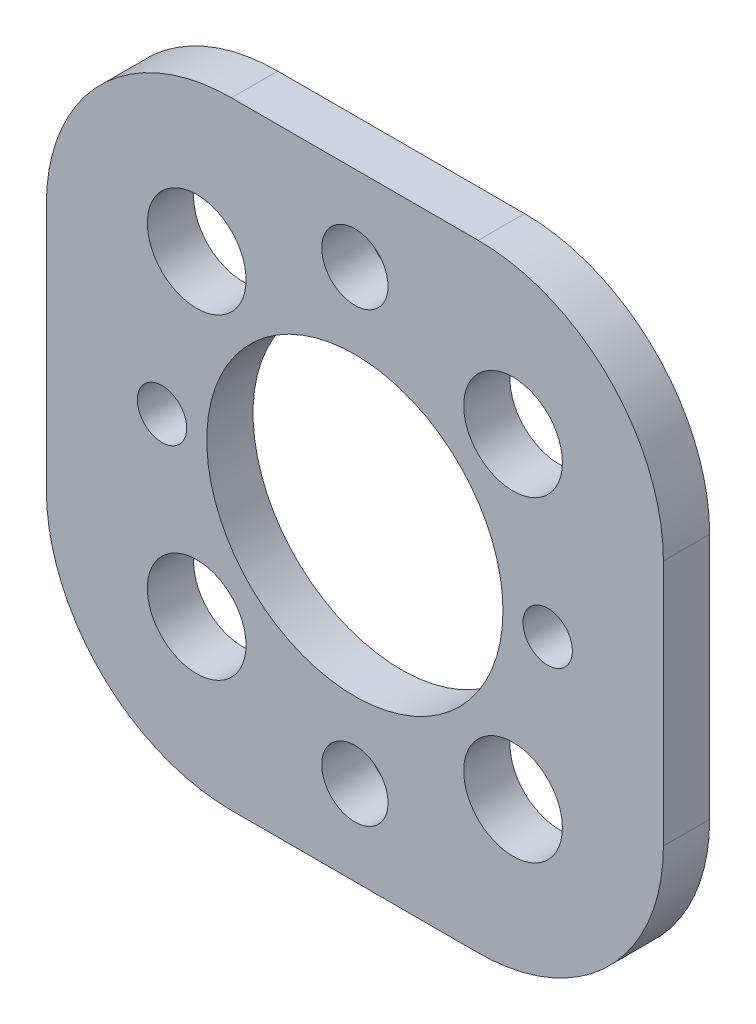
ISO-10303-21;
HEADER;
FILE_DESCRIPTION(('STEP AP214'),'2;1');
FILE_NAME('part.step','',(''),(''),'','','');
FILE_SCHEMA(('AUTOMOTIVE_DESIGN { 1 0 10303 214 1 1 1 1 }'));
ENDSEC;
DATA;
#1=APPLICATION_CONTEXT('core data for automotive mechanical design processes');
#2=APPLICATION_PROTOCOL_DEFINITION('international standard','automotive_design',2000,#1);
#3=PRODUCT_CONTEXT('',#1,'mechanical');
#4=PRODUCT('Part','Part','',(#3));
#5=PRODUCT_RELATED_PRODUCT_CATEGORY('part','',(#4));
#6=PRODUCT_DEFINITION_FORMATION('','',#4);
#7=PRODUCT_DEFINITION_CONTEXT('part definition',#1,'design');
#8=PRODUCT_DEFINITION('design','',#6,#7);
#9=PRODUCT_DEFINITION_SHAPE('','',#8);
#10=(LENGTH_UNIT() NAMED_UNIT(*) SI_UNIT(.MILLI.,.METRE.));
#11=(NAMED_UNIT(*) PLANE_ANGLE_UNIT() SI_UNIT($,.RADIAN.));
#12=(NAMED_UNIT(*) SI_UNIT($,.STERADIAN.) SOLID_ANGLE_UNIT());
#13=UNCERTAINTY_MEASURE_WITH_UNIT(LENGTH_MEASURE(1.E-05),#10,'distance_accuracy_value','');
#14=(GEOMETRIC_REPRESENTATION_CONTEXT(3) GLOBAL_UNCERTAINTY_ASSIGNED_CONTEXT((#13)) GLOBAL_UNIT_ASSIGNED_CONTEXT((#10,
#11,#12)) REPRESENTATION_CONTEXT('',''));
#15=CARTESIAN_POINT('',(0.,0.,0.));
#16=DIRECTION('',(0.,0.,1.));
#17=DIRECTION('',(1.,0.,0.));
#18=AXIS2_PLACEMENT_3D('',#15,#16,#17);
#19=CARTESIAN_POINT('',(-8.,-8.,3.));
#20=DIRECTION('',(0.,0.,-1.));
#21=DIRECTION('',(-1.,0.,0.));
#22=AXIS2_PLACEMENT_3D('',#19,#20,#21);
#23=PLANE('',#22);
#24=CARTESIAN_POINT('',(-8.,-8.,3.));
#25=DIRECTION('',(0.,0.,1.));
#26=DIRECTION('',(-1.,0.,0.));
#27=AXIS2_PLACEMENT_3D('',#24,#25,#26);
#28=CIRCLE('',#27,12.);
#29=CARTESIAN_POINT('',(-20.,-7.99999999999991,3.));
#30=VERTEX_POINT('',#29);
#31=CARTESIAN_POINT('',(-7.99999999999991,-20.,3.));
#32=VERTEX_POINT('',#31);
#33=EDGE_CURVE('E172',#30,#32,#28,.T.);
#34=ORIENTED_EDGE('',*,*,#33,.T.);
#35=DIRECTION('',(1.,0.,0.));
#36=VECTOR('',#35,1.);
#37=CARTESIAN_POINT('',(7.99999999999991,-20.,3.));
#38=LINE('',#37,#36);
#39=CARTESIAN_POINT('',(7.99999999999991,-20.,3.));
#40=VERTEX_POINT('',#39);
#41=EDGE_CURVE('E106',#32,#40,#38,.T.);
#42=ORIENTED_EDGE('',*,*,#41,.T.);
#43=CARTESIAN_POINT('',(8.,-8.,3.));
#44=DIRECTION('',(0.,0.,1.));
#45=DIRECTION('',(1.,0.,0.));
#46=AXIS2_PLACEMENT_3D('',#43,#44,#45);
#47=CIRCLE('',#46,12.);
#48=CARTESIAN_POINT('',(20.,-8.,3.));
#49=VERTEX_POINT('',#48);
#50=EDGE_CURVE('E195',#40,#49,#47,.T.);
#51=ORIENTED_EDGE('',*,*,#50,.T.);
#52=DIRECTION('',(0.,1.,0.));
#53=VECTOR('',#52,1.);
#54=CARTESIAN_POINT('',(20.,-7.99999999999991,3.));
#55=LINE('',#54,#53);
#56=CARTESIAN_POINT('',(20.,7.99999999999992,3.));
#57=VERTEX_POINT('',#56);
#58=EDGE_CURVE('E210',#49,#57,#55,.T.);
#59=ORIENTED_EDGE('',*,*,#58,.T.);
#60=CARTESIAN_POINT('',(8.,8.00000000000001,3.));
#61=DIRECTION('',(0.,0.,1.));
#62=DIRECTION('',(1.,0.,0.));
#63=AXIS2_PLACEMENT_3D('',#60,#61,#62);
#64=CIRCLE('',#63,12.);
#65=CARTESIAN_POINT('',(7.99999999999991,20.,3.));
#66=VERTEX_POINT('',#65);
#67=EDGE_CURVE('E122',#57,#66,#64,.T.);
#68=ORIENTED_EDGE('',*,*,#67,.T.);
#69=DIRECTION('',(-1.,0.,0.));
#70=VECTOR('',#69,1.);
#71=CARTESIAN_POINT('',(7.99999999999991,20.,3.));
#72=LINE('',#71,#70);
#73=CARTESIAN_POINT('',(-7.99999999999992,20.,3.));
#74=VERTEX_POINT('',#73);
#75=EDGE_CURVE('E116',#66,#74,#72,.T.);
#76=ORIENTED_EDGE('',*,*,#75,.T.);
#77=CARTESIAN_POINT('',(-8.00000000000001,8.,3.));
#78=DIRECTION('',(0.,0.,1.));
#79=DIRECTION('',(1.,0.,0.));
#80=AXIS2_PLACEMENT_3D('',#77,#78,#79);
#81=CIRCLE('',#80,12.);
#82=CARTESIAN_POINT('',(-20.,7.99999999999992,3.));
#83=VERTEX_POINT('',#82);
#84=EDGE_CURVE('E125',#74,#83,#81,.T.);
#85=ORIENTED_EDGE('',*,*,#84,.T.);
#86=DIRECTION('',(0.,-1.,0.));
#87=VECTOR('',#86,1.);
#88=CARTESIAN_POINT('',(-20.,-7.99999999999991,3.));
#89=LINE('',#88,#87);
#90=EDGE_CURVE('E65',#83,#30,#89,.T.);
#91=ORIENTED_EDGE('',*,*,#90,.T.);
#92=EDGE_LOOP('',(#34,#42,#51,#59,#68,#76,#85,#91));
#93=FACE_BOUND('',#92,.T.);
#94=CARTESIAN_POINT('',(0.,0.,3.));
#95=DIRECTION('',(0.,0.,1.));
#96=DIRECTION('',(1.,0.,0.));
#97=AXIS2_PLACEMENT_3D('',#94,#95,#96);
#98=CIRCLE('',#97,9.6);
#99=CARTESIAN_POINT('',(9.6,0.,3.));
#100=VERTEX_POINT('',#99);
#101=EDGE_CURVE('E153',#100,#100,#98,.T.);
#102=ORIENTED_EDGE('',*,*,#101,.F.);
#103=EDGE_LOOP('',(#102));
#104=FACE_BOUND('',#103,.T.);
#105=CARTESIAN_POINT('',(0.,14.5,3.));
#106=DIRECTION('',(0.,0.,1.));
#107=DIRECTION('',(1.,0.,0.));
#108=AXIS2_PLACEMENT_3D('',#105,#106,#107);
#109=CIRCLE('',#108,2.15);
#110=CARTESIAN_POINT('',(2.15,14.5,3.));
#111=VERTEX_POINT('',#110);
#112=EDGE_CURVE('E225',#111,#111,#109,.T.);
#113=ORIENTED_EDGE('',*,*,#112,.F.);
#114=EDGE_LOOP('',(#113));
#115=FACE_BOUND('',#114,.T.);
#116=CARTESIAN_POINT('',(-12.5,0.,3.));
#117=DIRECTION('',(0.,0.,1.));
#118=DIRECTION('',(1.,0.,0.));
#119=AXIS2_PLACEMENT_3D('',#116,#117,#118);
#120=CIRCLE('',#119,1.6);
#121=CARTESIAN_POINT('',(-10.9,0.,3.));
#122=VERTEX_POINT('',#121);
#123=EDGE_CURVE('E228',#122,#122,#120,.T.);
#124=ORIENTED_EDGE('',*,*,#123,.F.);
#125=EDGE_LOOP('',(#124));
#126=FACE_BOUND('',#125,.T.);
#127=CARTESIAN_POINT('',(12.5,0.,3.));
#128=DIRECTION('',(0.,0.,1.));
#129=DIRECTION('',(1.,0.,0.));
#130=AXIS2_PLACEMENT_3D('',#127,#128,#129);
#131=CIRCLE('',#130,1.6);
#132=CARTESIAN_POINT('',(14.1,0.,3.));
#133=VERTEX_POINT('',#132);
#134=EDGE_CURVE('E236',#133,#133,#131,.T.);
#135=ORIENTED_EDGE('',*,*,#134,.F.);
#136=EDGE_LOOP('',(#135));
#137=FACE_BOUND('',#136,.T.);
#138=CARTESIAN_POINT('',(0.,-14.5,3.));
#139=DIRECTION('',(0.,0.,1.));
#140=DIRECTION('',(1.,0.,0.));
#141=AXIS2_PLACEMENT_3D('',#138,#139,#140);
#142=CIRCLE('',#141,2.15);
#143=CARTESIAN_POINT('',(2.15,-14.5,3.));
#144=VERTEX_POINT('',#143);
#145=EDGE_CURVE('E249',#144,#144,#142,.T.);
#146=ORIENTED_EDGE('',*,*,#145,.F.);
#147=EDGE_LOOP('',(#146));
#148=FACE_BOUND('',#147,.T.);
#149=CARTESIAN_POINT('',(10.2530483272049,10.2530483272049,3.));
#150=DIRECTION('',(0.,0.,1.));
#151=DIRECTION('',(1.,0.,0.));
#152=AXIS2_PLACEMENT_3D('',#149,#150,#151);
#153=CIRCLE('',#152,3.2);
#154=CARTESIAN_POINT('',(13.4530483272049,10.2530483272049,3.));
#155=VERTEX_POINT('',#154);
#156=EDGE_CURVE('E255',#155,#155,#153,.T.);
#157=ORIENTED_EDGE('',*,*,#156,.F.);
#158=EDGE_LOOP('',(#157));
#159=FACE_BOUND('',#158,.T.);
#160=CARTESIAN_POINT('',(10.2530483272049,-10.2530483272049,3.));
#161=DIRECTION('',(0.,0.,1.));
#162=DIRECTION('',(1.,0.,0.));
#163=AXIS2_PLACEMENT_3D('',#160,#161,#162);
#164=CIRCLE('',#163,3.2);
#165=CARTESIAN_POINT('',(13.4530483272049,-10.2530483272049,3.));
#166=VERTEX_POINT('',#165);
#167=EDGE_CURVE('E265',#166,#166,#164,.T.);
#168=ORIENTED_EDGE('',*,*,#167,.F.);
#169=EDGE_LOOP('',(#168));
#170=FACE_BOUND('',#169,.T.);
#171=CARTESIAN_POINT('',(-10.2530483272049,-10.2530483272049,3.));
#172=DIRECTION('',(0.,0.,1.));
#173=DIRECTION('',(1.,0.,0.));
#174=AXIS2_PLACEMENT_3D('',#171,#172,#173);
#175=CIRCLE('',#174,3.2);
#176=CARTESIAN_POINT('',(-7.05304832720494,-10.2530483272049,3.));
#177=VERTEX_POINT('',#176);
#178=EDGE_CURVE('E269',#177,#177,#175,.T.);
#179=ORIENTED_EDGE('',*,*,#178,.F.);
#180=EDGE_LOOP('',(#179));
#181=FACE_BOUND('',#180,.T.);
#182=CARTESIAN_POINT('',(-10.2530483272049,10.2530483272049,3.));
#183=DIRECTION('',(0.,0.,1.));
#184=DIRECTION('',(1.,0.,0.));
#185=AXIS2_PLACEMENT_3D('',#182,#183,#184);
#186=CIRCLE('',#185,3.2);
#187=CARTESIAN_POINT('',(-7.05304832720494,10.2530483272049,3.));
#188=VERTEX_POINT('',#187);
#189=EDGE_CURVE('E279',#188,#188,#186,.T.);
#190=ORIENTED_EDGE('',*,*,#189,.F.);
#191=EDGE_LOOP('',(#190));
#192=FACE_BOUND('',#191,.T.);
#193=ADVANCED_FACE('F44',(#93,#104,#115,#126,#137,#148,#159,#170,#181,#192),#23,.F.);
#194=CARTESIAN_POINT('',(-8.,-8.,0.));
#195=DIRECTION('',(0.,0.,-1.));
#196=DIRECTION('',(-1.,0.,0.));
#197=AXIS2_PLACEMENT_3D('',#194,#195,#196);
#198=PLANE('',#197);
#199=CARTESIAN_POINT('',(-10.2530483272049,-10.2530483272049,0.));
#200=DIRECTION('',(0.,0.,1.));
#201=DIRECTION('',(1.,0.,0.));
#202=AXIS2_PLACEMENT_3D('',#199,#200,#201);
#203=CIRCLE('',#202,3.2);
#204=CARTESIAN_POINT('',(-7.05304832720494,-10.2530483272049,0.));
#205=VERTEX_POINT('',#204);
#206=EDGE_CURVE('E273',#205,#205,#203,.T.);
#207=ORIENTED_EDGE('',*,*,#206,.T.);
#208=EDGE_LOOP('',(#207));
#209=FACE_BOUND('',#208,.T.);
#210=CARTESIAN_POINT('',(10.2530483272049,10.2530483272049,0.));
#211=DIRECTION('',(0.,0.,1.));
#212=DIRECTION('',(1.,0.,0.));
#213=AXIS2_PLACEMENT_3D('',#210,#211,#212);
#214=CIRCLE('',#213,3.2);
#215=CARTESIAN_POINT('',(13.4530483272049,10.2530483272049,0.));
#216=VERTEX_POINT('',#215);
#217=EDGE_CURVE('E256',#216,#216,#214,.T.);
#218=ORIENTED_EDGE('',*,*,#217,.T.);
#219=EDGE_LOOP('',(#218));
#220=FACE_BOUND('',#219,.T.);
#221=CARTESIAN_POINT('',(12.5,0.,0.));
#222=DIRECTION('',(0.,0.,1.));
#223=DIRECTION('',(1.,0.,0.));
#224=AXIS2_PLACEMENT_3D('',#221,#222,#223);
#225=CIRCLE('',#224,1.6);
#226=CARTESIAN_POINT('',(14.1,0.,0.));
#227=VERTEX_POINT('',#226);
#228=EDGE_CURVE('E244',#227,#227,#225,.T.);
#229=ORIENTED_EDGE('',*,*,#228,.T.);
#230=EDGE_LOOP('',(#229));
#231=FACE_BOUND('',#230,.T.);
#232=CARTESIAN_POINT('',(0.,14.5,0.));
#233=DIRECTION('',(0.,0.,1.));
#234=DIRECTION('',(1.,0.,0.));
#235=AXIS2_PLACEMENT_3D('',#232,#233,#234);
#236=CIRCLE('',#235,2.15);
#237=CARTESIAN_POINT('',(2.15,14.5,0.));
#238=VERTEX_POINT('',#237);
#239=EDGE_CURVE('E227',#238,#238,#236,.T.);
#240=ORIENTED_EDGE('',*,*,#239,.T.);
#241=EDGE_LOOP('',(#240));
#242=FACE_BOUND('',#241,.T.);
#243=CARTESIAN_POINT('',(-8.,-8.,0.));
#244=DIRECTION('',(0.,0.,1.));
#245=DIRECTION('',(-1.,0.,0.));
#246=AXIS2_PLACEMENT_3D('',#243,#244,#245);
#247=CIRCLE('',#246,12.);
#248=CARTESIAN_POINT('',(-20.,-7.99999999999991,0.));
#249=VERTEX_POINT('',#248);
#250=CARTESIAN_POINT('',(-7.99999999999991,-20.,0.));
#251=VERTEX_POINT('',#250);
#252=EDGE_CURVE('E146',#249,#251,#247,.T.);
#253=ORIENTED_EDGE('',*,*,#252,.F.);
#254=DIRECTION('',(0.,-1.,0.));
#255=VECTOR('',#254,1.);
#256=CARTESIAN_POINT('',(-20.,-7.99999999999991,0.));
#257=LINE('',#256,#255);
#258=CARTESIAN_POINT('',(-20.,7.99999999999992,0.));
#259=VERTEX_POINT('',#258);
#260=EDGE_CURVE('E98',#259,#249,#257,.T.);
#261=ORIENTED_EDGE('',*,*,#260,.F.);
#262=CARTESIAN_POINT('',(-8.00000000000001,8.,0.));
#263=DIRECTION('',(0.,0.,1.));
#264=DIRECTION('',(1.,0.,0.));
#265=AXIS2_PLACEMENT_3D('',#262,#263,#264);
#266=CIRCLE('',#265,12.);
#267=CARTESIAN_POINT('',(-7.99999999999992,20.,0.));
#268=VERTEX_POINT('',#267);
#269=EDGE_CURVE('E95',#268,#259,#266,.T.);
#270=ORIENTED_EDGE('',*,*,#269,.F.);
#271=DIRECTION('',(-1.,0.,0.));
#272=VECTOR('',#271,1.);
#273=CARTESIAN_POINT('',(7.99999999999991,20.,0.));
#274=LINE('',#273,#272);
#275=CARTESIAN_POINT('',(7.99999999999991,20.,0.));
#276=VERTEX_POINT('',#275);
#277=EDGE_CURVE('E131',#276,#268,#274,.T.);
#278=ORIENTED_EDGE('',*,*,#277,.F.);
#279=CARTESIAN_POINT('',(8.,8.00000000000001,0.));
#280=DIRECTION('',(0.,0.,1.));
#281=DIRECTION('',(1.,0.,0.));
#282=AXIS2_PLACEMENT_3D('',#279,#280,#281);
#283=CIRCLE('',#282,12.);
#284=CARTESIAN_POINT('',(20.,7.99999999999992,0.));
#285=VERTEX_POINT('',#284);
#286=EDGE_CURVE('E165',#285,#276,#283,.T.);
#287=ORIENTED_EDGE('',*,*,#286,.F.);
#288=DIRECTION('',(0.,1.,0.));
#289=VECTOR('',#288,1.);
#290=CARTESIAN_POINT('',(20.,-7.99999999999991,0.));
#291=LINE('',#290,#289);
#292=CARTESIAN_POINT('',(20.,-8.,0.));
#293=VERTEX_POINT('',#292);
#294=EDGE_CURVE('E157',#293,#285,#291,.T.);
#295=ORIENTED_EDGE('',*,*,#294,.F.);
#296=CARTESIAN_POINT('',(8.,-8.,0.));
#297=DIRECTION('',(0.,0.,1.));
#298=DIRECTION('',(1.,0.,0.));
#299=AXIS2_PLACEMENT_3D('',#296,#297,#298);
#300=CIRCLE('',#299,12.);
#301=CARTESIAN_POINT('',(7.99999999999991,-20.,0.));
#302=VERTEX_POINT('',#301);
#303=EDGE_CURVE('E156',#302,#293,#300,.T.);
#304=ORIENTED_EDGE('',*,*,#303,.F.);
#305=DIRECTION('',(1.,0.,0.));
#306=VECTOR('',#305,1.);
#307=CARTESIAN_POINT('',(7.99999999999991,-20.,0.));
#308=LINE('',#307,#306);
#309=EDGE_CURVE('E155',#251,#302,#308,.T.);
#310=ORIENTED_EDGE('',*,*,#309,.F.);
#311=EDGE_LOOP('',(#253,#261,#270,#278,#287,#295,#304,#310));
#312=FACE_BOUND('',#311,.T.);
#313=CARTESIAN_POINT('',(0.,0.,0.));
#314=DIRECTION('',(0.,0.,1.));
#315=DIRECTION('',(1.,0.,0.));
#316=AXIS2_PLACEMENT_3D('',#313,#314,#315);
#317=CIRCLE('',#316,9.6);
#318=CARTESIAN_POINT('',(9.6,0.,0.));
#319=VERTEX_POINT('',#318);
#320=EDGE_CURVE('E217',#319,#319,#317,.T.);
#321=ORIENTED_EDGE('',*,*,#320,.T.);
#322=EDGE_LOOP('',(#321));
#323=FACE_BOUND('',#322,.T.);
#324=CARTESIAN_POINT('',(-12.5,0.,0.));
#325=DIRECTION('',(0.,0.,1.));
#326=DIRECTION('',(1.,0.,0.));
#327=AXIS2_PLACEMENT_3D('',#324,#325,#326);
#328=CIRCLE('',#327,1.6);
#329=CARTESIAN_POINT('',(-10.9,0.,0.));
#330=VERTEX_POINT('',#329);
#331=EDGE_CURVE('E233',#330,#330,#328,.T.);
#332=ORIENTED_EDGE('',*,*,#331,.T.);
#333=EDGE_LOOP('',(#332));
#334=FACE_BOUND('',#333,.T.);
#335=CARTESIAN_POINT('',(0.,-14.5,0.));
#336=DIRECTION('',(0.,0.,1.));
#337=DIRECTION('',(1.,0.,0.));
#338=AXIS2_PLACEMENT_3D('',#335,#336,#337);
#339=CIRCLE('',#338,2.15);
#340=CARTESIAN_POINT('',(2.15,-14.5,0.));
#341=VERTEX_POINT('',#340);
#342=EDGE_CURVE('E247',#341,#341,#339,.T.);
#343=ORIENTED_EDGE('',*,*,#342,.T.);
#344=EDGE_LOOP('',(#343));
#345=FACE_BOUND('',#344,.T.);
#346=CARTESIAN_POINT('',(10.2530483272049,-10.2530483272049,0.));
#347=DIRECTION('',(0.,0.,1.));
#348=DIRECTION('',(1.,0.,0.));
#349=AXIS2_PLACEMENT_3D('',#346,#347,#348);
#350=CIRCLE('',#349,3.2);
#351=CARTESIAN_POINT('',(13.4530483272049,-10.2530483272049,0.));
#352=VERTEX_POINT('',#351);
#353=EDGE_CURVE('E266',#352,#352,#350,.T.);
#354=ORIENTED_EDGE('',*,*,#353,.T.);
#355=EDGE_LOOP('',(#354));
#356=FACE_BOUND('',#355,.T.);
#357=CARTESIAN_POINT('',(-10.2530483272049,10.2530483272049,0.));
#358=DIRECTION('',(0.,0.,1.));
#359=DIRECTION('',(1.,0.,0.));
#360=AXIS2_PLACEMENT_3D('',#357,#358,#359);
#361=CIRCLE('',#360,3.2);
#362=CARTESIAN_POINT('',(-7.05304832720494,10.2530483272049,0.));
#363=VERTEX_POINT('',#362);
#364=EDGE_CURVE('E284',#363,#363,#361,.T.);
#365=ORIENTED_EDGE('',*,*,#364,.T.);
#366=EDGE_LOOP('',(#365));
#367=FACE_BOUND('',#366,.T.);
#368=ADVANCED_FACE('F197',(#209,#220,#231,#242,#312,#323,#334,#345,#356,#367),#198,.T.);
#369=CARTESIAN_POINT('',(-8.,-8.,3.));
#370=DIRECTION('',(0.,0.,-1.));
#371=DIRECTION('',(-1.,0.,0.));
#372=AXIS2_PLACEMENT_3D('',#369,#370,#371);
#373=CYLINDRICAL_SURFACE('',#372,12.);
#374=ORIENTED_EDGE('',*,*,#252,.T.);
#375=DIRECTION('',(0.,0.,-1.));
#376=VECTOR('',#375,1.);
#377=CARTESIAN_POINT('',(-7.99999999999991,-20.,3.));
#378=LINE('',#377,#376);
#379=EDGE_CURVE('E11',#32,#251,#378,.T.);
#380=ORIENTED_EDGE('',*,*,#379,.F.);
#381=ORIENTED_EDGE('',*,*,#33,.F.);
#382=DIRECTION('',(0.,0.,-1.));
#383=VECTOR('',#382,1.);
#384=CARTESIAN_POINT('',(-20.,-7.99999999999991,3.));
#385=LINE('',#384,#383);
#386=EDGE_CURVE('E145',#30,#249,#385,.T.);
#387=ORIENTED_EDGE('',*,*,#386,.T.);
#388=EDGE_LOOP('',(#374,#380,#381,#387));
#389=FACE_BOUND('',#388,.T.);
#390=ADVANCED_FACE('F50',(#389),#373,.T.);
#391=CARTESIAN_POINT('',(7.99999999999991,-20.,3.));
#392=DIRECTION('',(0.,1.,0.));
#393=DIRECTION('',(-1.,0.,0.));
#394=AXIS2_PLACEMENT_3D('',#391,#392,#393);
#395=PLANE('',#394);
#396=ORIENTED_EDGE('',*,*,#309,.T.);
#397=DIRECTION('',(0.,0.,-1.));
#398=VECTOR('',#397,1.);
#399=CARTESIAN_POINT('',(7.99999999999991,-20.,3.));
#400=LINE('',#399,#398);
#401=EDGE_CURVE('E54',#40,#302,#400,.T.);
#402=ORIENTED_EDGE('',*,*,#401,.F.);
#403=ORIENTED_EDGE('',*,*,#41,.F.);
#404=ORIENTED_EDGE('',*,*,#379,.T.);
#405=EDGE_LOOP('',(#396,#402,#403,#404));
#406=FACE_BOUND('',#405,.T.);
#407=ADVANCED_FACE('F320',(#406),#395,.F.);
#408=CARTESIAN_POINT('',(8.,-8.,3.));
#409=DIRECTION('',(0.,0.,-1.));
#410=DIRECTION('',(-1.,0.,0.));
#411=AXIS2_PLACEMENT_3D('',#408,#409,#410);
#412=CYLINDRICAL_SURFACE('',#411,12.);
#413=ORIENTED_EDGE('',*,*,#303,.T.);
#414=DIRECTION('',(0.,0.,-1.));
#415=VECTOR('',#414,1.);
#416=CARTESIAN_POINT('',(20.,-8.,3.));
#417=LINE('',#416,#415);
#418=EDGE_CURVE('E185',#49,#293,#417,.T.);
#419=ORIENTED_EDGE('',*,*,#418,.F.);
#420=ORIENTED_EDGE('',*,*,#50,.F.);
#421=ORIENTED_EDGE('',*,*,#401,.T.);
#422=EDGE_LOOP('',(#413,#419,#420,#421));
#423=FACE_BOUND('',#422,.T.);
#424=ADVANCED_FACE('F194',(#423),#412,.T.);
#425=CARTESIAN_POINT('',(20.,-7.99999999999991,3.));
#426=DIRECTION('',(-1.,0.,0.));
#427=DIRECTION('',(0.,0.,1.));
#428=AXIS2_PLACEMENT_3D('',#425,#426,#427);
#429=PLANE('',#428);
#430=ORIENTED_EDGE('',*,*,#294,.T.);
#431=DIRECTION('',(0.,0.,-1.));
#432=VECTOR('',#431,1.);
#433=CARTESIAN_POINT('',(20.,7.99999999999992,3.));
#434=LINE('',#433,#432);
#435=EDGE_CURVE('E180',#57,#285,#434,.T.);
#436=ORIENTED_EDGE('',*,*,#435,.F.);
#437=ORIENTED_EDGE('',*,*,#58,.F.);
#438=ORIENTED_EDGE('',*,*,#418,.T.);
#439=EDGE_LOOP('',(#430,#436,#437,#438));
#440=FACE_BOUND('',#439,.T.);
#441=ADVANCED_FACE('F205',(#440),#429,.F.);
#442=CARTESIAN_POINT('',(8.,8.00000000000001,3.));
#443=DIRECTION('',(0.,0.,-1.));
#444=DIRECTION('',(-1.,0.,0.));
#445=AXIS2_PLACEMENT_3D('',#442,#443,#444);
#446=CYLINDRICAL_SURFACE('',#445,12.);
#447=ORIENTED_EDGE('',*,*,#286,.T.);
#448=DIRECTION('',(0.,0.,-1.));
#449=VECTOR('',#448,1.);
#450=CARTESIAN_POINT('',(7.99999999999991,20.,3.));
#451=LINE('',#450,#449);
#452=EDGE_CURVE('E139',#66,#276,#451,.T.);
#453=ORIENTED_EDGE('',*,*,#452,.F.);
#454=ORIENTED_EDGE('',*,*,#67,.F.);
#455=ORIENTED_EDGE('',*,*,#435,.T.);
#456=EDGE_LOOP('',(#447,#453,#454,#455));
#457=FACE_BOUND('',#456,.T.);
#458=ADVANCED_FACE('F202',(#457),#446,.T.);
#459=CARTESIAN_POINT('',(7.99999999999991,20.,3.));
#460=DIRECTION('',(0.,-1.,0.));
#461=DIRECTION('',(0.,0.,-1.));
#462=AXIS2_PLACEMENT_3D('',#459,#460,#461);
#463=PLANE('',#462);
#464=ORIENTED_EDGE('',*,*,#277,.T.);
#465=DIRECTION('',(0.,0.,-1.));
#466=VECTOR('',#465,1.);
#467=CARTESIAN_POINT('',(-7.99999999999992,20.,3.));
#468=LINE('',#467,#466);
#469=EDGE_CURVE('E132',#74,#268,#468,.T.);
#470=ORIENTED_EDGE('',*,*,#469,.F.);
#471=ORIENTED_EDGE('',*,*,#75,.F.);
#472=ORIENTED_EDGE('',*,*,#452,.T.);
#473=EDGE_LOOP('',(#464,#470,#471,#472));
#474=FACE_BOUND('',#473,.T.);
#475=ADVANCED_FACE('F134',(#474),#463,.F.);
#476=CARTESIAN_POINT('',(-8.00000000000001,8.,3.));
#477=DIRECTION('',(0.,0.,-1.));
#478=DIRECTION('',(-1.,0.,0.));
#479=AXIS2_PLACEMENT_3D('',#476,#477,#478);
#480=CYLINDRICAL_SURFACE('',#479,12.);
#481=ORIENTED_EDGE('',*,*,#269,.T.);
#482=DIRECTION('',(0.,0.,-1.));
#483=VECTOR('',#482,1.);
#484=CARTESIAN_POINT('',(-20.,7.99999999999992,3.));
#485=LINE('',#484,#483);
#486=EDGE_CURVE('E136',#83,#259,#485,.T.);
#487=ORIENTED_EDGE('',*,*,#486,.F.);
#488=ORIENTED_EDGE('',*,*,#84,.F.);
#489=ORIENTED_EDGE('',*,*,#469,.T.);
#490=EDGE_LOOP('',(#481,#487,#488,#489));
#491=FACE_BOUND('',#490,.T.);
#492=ADVANCED_FACE('F138',(#491),#480,.T.);
#493=CARTESIAN_POINT('',(-20.,-7.99999999999991,3.));
#494=DIRECTION('',(1.,0.,0.));
#495=DIRECTION('',(0.,0.,-1.));
#496=AXIS2_PLACEMENT_3D('',#493,#494,#495);
#497=PLANE('',#496);
#498=ORIENTED_EDGE('',*,*,#260,.T.);
#499=ORIENTED_EDGE('',*,*,#386,.F.);
#500=ORIENTED_EDGE('',*,*,#90,.F.);
#501=ORIENTED_EDGE('',*,*,#486,.T.);
#502=EDGE_LOOP('',(#498,#499,#500,#501));
#503=FACE_BOUND('',#502,.T.);
#504=ADVANCED_FACE('F302',(#503),#497,.F.);
#505=CARTESIAN_POINT('',(0.,0.,3.));
#506=DIRECTION('',(0.,0.,-1.));
#507=DIRECTION('',(-1.,0.,0.));
#508=AXIS2_PLACEMENT_3D('',#505,#506,#507);
#509=CYLINDRICAL_SURFACE('',#508,9.6);
#510=ORIENTED_EDGE('',*,*,#101,.T.);
#511=EDGE_LOOP('',(#510));
#512=FACE_BOUND('',#511,.T.);
#513=ORIENTED_EDGE('',*,*,#320,.F.);
#514=EDGE_LOOP('',(#513));
#515=FACE_BOUND('',#514,.T.);
#516=ADVANCED_FACE('F301',(#512,#515),#509,.F.);
#517=CARTESIAN_POINT('',(0.,14.5,3.));
#518=DIRECTION('',(0.,0.,-1.));
#519=DIRECTION('',(-1.,0.,0.));
#520=AXIS2_PLACEMENT_3D('',#517,#518,#519);
#521=CYLINDRICAL_SURFACE('',#520,2.15);
#522=ORIENTED_EDGE('',*,*,#112,.T.);
#523=EDGE_LOOP('',(#522));
#524=FACE_BOUND('',#523,.T.);
#525=ORIENTED_EDGE('',*,*,#239,.F.);
#526=EDGE_LOOP('',(#525));
#527=FACE_BOUND('',#526,.T.);
#528=ADVANCED_FACE('F379',(#524,#527),#521,.F.);
#529=CARTESIAN_POINT('',(-12.5,0.,3.));
#530=DIRECTION('',(0.,0.,-1.));
#531=DIRECTION('',(-1.,0.,0.));
#532=AXIS2_PLACEMENT_3D('',#529,#530,#531);
#533=CYLINDRICAL_SURFACE('',#532,1.6);
#534=ORIENTED_EDGE('',*,*,#123,.T.);
#535=EDGE_LOOP('',(#534));
#536=FACE_BOUND('',#535,.T.);
#537=ORIENTED_EDGE('',*,*,#331,.F.);
#538=EDGE_LOOP('',(#537));
#539=FACE_BOUND('',#538,.T.);
#540=ADVANCED_FACE('F389',(#536,#539),#533,.F.);
#541=CARTESIAN_POINT('',(12.5,0.,3.));
#542=DIRECTION('',(0.,0.,-1.));
#543=DIRECTION('',(-1.,0.,0.));
#544=AXIS2_PLACEMENT_3D('',#541,#542,#543);
#545=CYLINDRICAL_SURFACE('',#544,1.6);
#546=ORIENTED_EDGE('',*,*,#134,.T.);
#547=EDGE_LOOP('',(#546));
#548=FACE_BOUND('',#547,.T.);
#549=ORIENTED_EDGE('',*,*,#228,.F.);
#550=EDGE_LOOP('',(#549));
#551=FACE_BOUND('',#550,.T.);
#552=ADVANCED_FACE('F399',(#548,#551),#545,.F.);
#553=CARTESIAN_POINT('',(0.,-14.5,3.));
#554=DIRECTION('',(0.,0.,-1.));
#555=DIRECTION('',(-1.,0.,0.));
#556=AXIS2_PLACEMENT_3D('',#553,#554,#555);
#557=CYLINDRICAL_SURFACE('',#556,2.15);
#558=ORIENTED_EDGE('',*,*,#145,.T.);
#559=EDGE_LOOP('',(#558));
#560=FACE_BOUND('',#559,.T.);
#561=ORIENTED_EDGE('',*,*,#342,.F.);
#562=EDGE_LOOP('',(#561));
#563=FACE_BOUND('',#562,.T.);
#564=ADVANCED_FACE('F403',(#560,#563),#557,.F.);
#565=CARTESIAN_POINT('',(10.2530483272049,10.2530483272049,3.));
#566=DIRECTION('',(0.,0.,-1.));
#567=DIRECTION('',(-1.,0.,0.));
#568=AXIS2_PLACEMENT_3D('',#565,#566,#567);
#569=CYLINDRICAL_SURFACE('',#568,3.2);
#570=ORIENTED_EDGE('',*,*,#156,.T.);
#571=EDGE_LOOP('',(#570));
#572=FACE_BOUND('',#571,.T.);
#573=ORIENTED_EDGE('',*,*,#217,.F.);
#574=EDGE_LOOP('',(#573));
#575=FACE_BOUND('',#574,.T.);
#576=ADVANCED_FACE('F413',(#572,#575),#569,.F.);
#577=CARTESIAN_POINT('',(10.2530483272049,-10.2530483272049,3.));
#578=DIRECTION('',(0.,0.,-1.));
#579=DIRECTION('',(-1.,0.,0.));
#580=AXIS2_PLACEMENT_3D('',#577,#578,#579);
#581=CYLINDRICAL_SURFACE('',#580,3.2);
#582=ORIENTED_EDGE('',*,*,#167,.T.);
#583=EDGE_LOOP('',(#582));
#584=FACE_BOUND('',#583,.T.);
#585=ORIENTED_EDGE('',*,*,#353,.F.);
#586=EDGE_LOOP('',(#585));
#587=FACE_BOUND('',#586,.T.);
#588=ADVANCED_FACE('F421',(#584,#587),#581,.F.);
#589=CARTESIAN_POINT('',(-10.2530483272049,-10.2530483272049,3.));
#590=DIRECTION('',(0.,0.,-1.));
#591=DIRECTION('',(-1.,0.,0.));
#592=AXIS2_PLACEMENT_3D('',#589,#590,#591);
#593=CYLINDRICAL_SURFACE('',#592,3.2);
#594=ORIENTED_EDGE('',*,*,#178,.T.);
#595=EDGE_LOOP('',(#594));
#596=FACE_BOUND('',#595,.T.);
#597=ORIENTED_EDGE('',*,*,#206,.F.);
#598=EDGE_LOOP('',(#597));
#599=FACE_BOUND('',#598,.T.);
#600=ADVANCED_FACE('F435',(#596,#599),#593,.F.);
#601=CARTESIAN_POINT('',(-10.2530483272049,10.2530483272049,3.));
#602=DIRECTION('',(0.,0.,-1.));
#603=DIRECTION('',(-1.,0.,0.));
#604=AXIS2_PLACEMENT_3D('',#601,#602,#603);
#605=CYLINDRICAL_SURFACE('',#604,3.2);
#606=ORIENTED_EDGE('',*,*,#189,.T.);
#607=EDGE_LOOP('',(#606));
#608=FACE_BOUND('',#607,.T.);
#609=ORIENTED_EDGE('',*,*,#364,.F.);
#610=EDGE_LOOP('',(#609));
#611=FACE_BOUND('',#610,.T.);
#612=ADVANCED_FACE('F292',(#608,#611),#605,.F.);
#613=CLOSED_SHELL('',(#193,#368,#390,#407,#424,#441,#458,#475,#492,#504,#516,#528,#540,#552,
#564,#576,#588,#600,#612));
#614=MANIFOLD_SOLID_BREP('B2',#613);
#615=ADVANCED_BREP_SHAPE_REPRESENTATION('',(#18,#614),#14);
#616=SHAPE_DEFINITION_REPRESENTATION(#9,#615);
ENDSEC;
END-ISO-10303-21;
